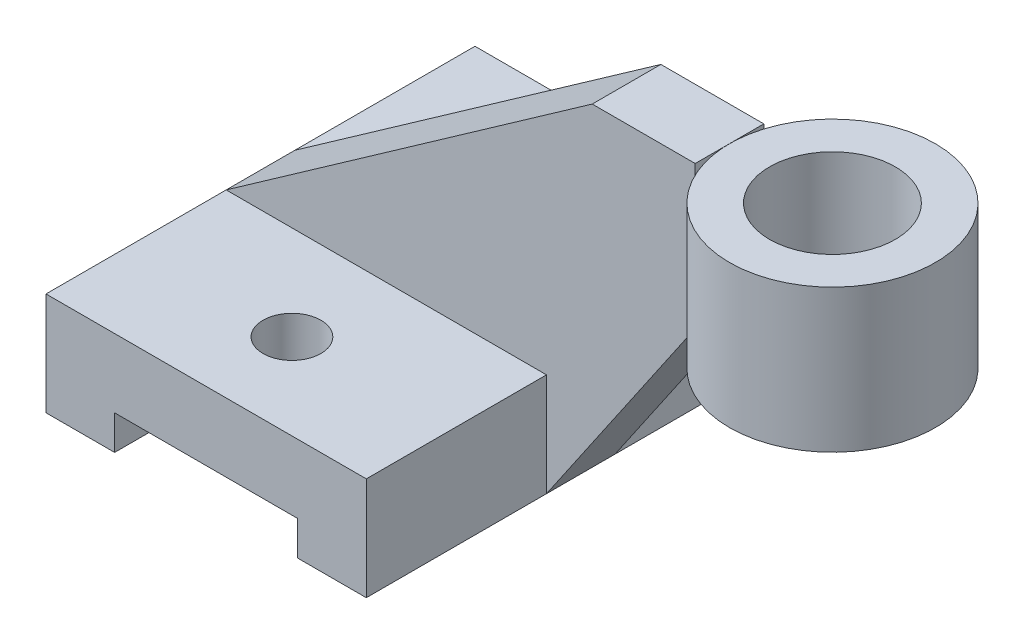
ISO-10303-21;
HEADER;
FILE_DESCRIPTION(('STEP AP214'),'2;1');
FILE_NAME('part.step','',(''),(''),'','','');
FILE_SCHEMA(('AUTOMOTIVE_DESIGN { 1 0 10303 214 1 1 1 1 }'));
ENDSEC;
DATA;
#1=APPLICATION_CONTEXT('core data for automotive mechanical design processes');
#2=APPLICATION_PROTOCOL_DEFINITION('international standard','automotive_design',2000,#1);
#3=PRODUCT_CONTEXT('',#1,'mechanical');
#4=PRODUCT('Part','Part','',(#3));
#5=PRODUCT_RELATED_PRODUCT_CATEGORY('part','',(#4));
#6=PRODUCT_DEFINITION_FORMATION('','',#4);
#7=PRODUCT_DEFINITION_CONTEXT('part definition',#1,'design');
#8=PRODUCT_DEFINITION('design','',#6,#7);
#9=PRODUCT_DEFINITION_SHAPE('','',#8);
#10=(LENGTH_UNIT() NAMED_UNIT(*) SI_UNIT(.MILLI.,.METRE.));
#11=(NAMED_UNIT(*) PLANE_ANGLE_UNIT() SI_UNIT($,.RADIAN.));
#12=(NAMED_UNIT(*) SI_UNIT($,.STERADIAN.) SOLID_ANGLE_UNIT());
#13=UNCERTAINTY_MEASURE_WITH_UNIT(LENGTH_MEASURE(1.E-05),#10,'distance_accuracy_value','');
#14=(GEOMETRIC_REPRESENTATION_CONTEXT(3) GLOBAL_UNCERTAINTY_ASSIGNED_CONTEXT((#13)) GLOBAL_UNIT_ASSIGNED_CONTEXT((#10,
#11,#12)) REPRESENTATION_CONTEXT('',''));
#15=CARTESIAN_POINT('',(0.,0.,0.));
#16=DIRECTION('',(0.,0.,1.));
#17=DIRECTION('',(1.,0.,0.));
#18=AXIS2_PLACEMENT_3D('',#15,#16,#17);
#19=CARTESIAN_POINT('',(72.,38.,0.));
#20=DIRECTION('',(0.,1.,0.));
#21=DIRECTION('',(0.,0.,1.));
#22=AXIS2_PLACEMENT_3D('',#19,#20,#21);
#23=CYLINDRICAL_SURFACE('',#22,18.);
#24=CARTESIAN_POINT('',(72.,38.,0.));
#25=DIRECTION('',(0.,1.,0.));
#26=DIRECTION('',(0.,0.,1.));
#27=AXIS2_PLACEMENT_3D('',#24,#25,#26);
#28=CIRCLE('',#27,18.);
#29=CARTESIAN_POINT('',(72.,38.,18.));
#30=VERTEX_POINT('',#29);
#31=EDGE_CURVE('E11',#30,#30,#28,.T.);
#32=ORIENTED_EDGE('',*,*,#31,.T.);
#33=EDGE_LOOP('',(#32));
#34=FACE_BOUND('',#33,.T.);
#35=CARTESIAN_POINT('',(72.,63.,0.));
#36=DIRECTION('',(0.,1.,0.));
#37=DIRECTION('',(0.,0.,1.));
#38=AXIS2_PLACEMENT_3D('',#35,#36,#37);
#39=CIRCLE('',#38,18.);
#40=CARTESIAN_POINT('',(72.,63.,18.));
#41=VERTEX_POINT('',#40);
#42=EDGE_CURVE('E50',#41,#41,#39,.T.);
#43=ORIENTED_EDGE('',*,*,#42,.F.);
#44=EDGE_LOOP('',(#43));
#45=FACE_BOUND('',#44,.T.);
#46=ADVANCED_FACE('F47',(#34,#45),#23,.T.);
#47=CARTESIAN_POINT('',(72.,38.,0.));
#48=DIRECTION('',(0.,1.,0.));
#49=DIRECTION('',(0.,0.,1.));
#50=AXIS2_PLACEMENT_3D('',#47,#48,#49);
#51=PLANE('',#50);
#52=CARTESIAN_POINT('',(72.,38.,0.));
#53=DIRECTION('',(0.,1.,0.));
#54=DIRECTION('',(0.,0.,1.));
#55=AXIS2_PLACEMENT_3D('',#52,#53,#54);
#56=CIRCLE('',#55,11.);
#57=CARTESIAN_POINT('',(72.,38.,11.));
#58=VERTEX_POINT('',#57);
#59=EDGE_CURVE('E57',#58,#58,#56,.T.);
#60=ORIENTED_EDGE('',*,*,#59,.T.);
#61=EDGE_LOOP('',(#60));
#62=FACE_BOUND('',#61,.T.);
#63=ORIENTED_EDGE('',*,*,#31,.F.);
#64=EDGE_LOOP('',(#63));
#65=FACE_BOUND('',#64,.T.);
#66=ADVANCED_FACE('F65',(#62,#65),#51,.F.);
#67=CARTESIAN_POINT('',(72.,63.,0.));
#68=DIRECTION('',(0.,1.,0.));
#69=DIRECTION('',(0.,0.,1.));
#70=AXIS2_PLACEMENT_3D('',#67,#68,#69);
#71=PLANE('',#70);
#72=CARTESIAN_POINT('',(72.,63.,0.));
#73=DIRECTION('',(0.,1.,0.));
#74=DIRECTION('',(0.,0.,1.));
#75=AXIS2_PLACEMENT_3D('',#72,#73,#74);
#76=CIRCLE('',#75,11.);
#77=CARTESIAN_POINT('',(72.,63.,11.));
#78=VERTEX_POINT('',#77);
#79=EDGE_CURVE('E59',#78,#78,#76,.T.);
#80=ORIENTED_EDGE('',*,*,#79,.F.);
#81=EDGE_LOOP('',(#80));
#82=FACE_BOUND('',#81,.T.);
#83=ORIENTED_EDGE('',*,*,#42,.T.);
#84=EDGE_LOOP('',(#83));
#85=FACE_BOUND('',#84,.T.);
#86=ADVANCED_FACE('F71',(#82,#85),#71,.T.);
#87=CARTESIAN_POINT('',(72.,38.,0.));
#88=DIRECTION('',(0.,1.,0.));
#89=DIRECTION('',(0.,0.,1.));
#90=AXIS2_PLACEMENT_3D('',#87,#88,#89);
#91=CYLINDRICAL_SURFACE('',#90,11.);
#92=ORIENTED_EDGE('',*,*,#59,.F.);
#93=EDGE_LOOP('',(#92));
#94=FACE_BOUND('',#93,.T.);
#95=ORIENTED_EDGE('',*,*,#79,.T.);
#96=EDGE_LOOP('',(#95));
#97=FACE_BOUND('',#96,.T.);
#98=ADVANCED_FACE('F68',(#94,#97),#91,.F.);
#99=CLOSED_SHELL('',(#46,#66,#86,#98));
#100=MANIFOLD_SOLID_BREP('B2',#99);
#101=CARTESIAN_POINT('',(28.,18.,37.5));
#102=DIRECTION('',(-1.,0.,0.));
#103=DIRECTION('',(0.,0.,1.));
#104=AXIS2_PLACEMENT_3D('',#101,#102,#103);
#105=PLANE('',#104);
#106=DIRECTION('',(0.,-1.,0.));
#107=VECTOR('',#106,1.);
#108=CARTESIAN_POINT('',(28.,18.,6.));
#109=LINE('',#108,#107);
#110=CARTESIAN_POINT('',(28.,18.,6.));
#111=VERTEX_POINT('',#110);
#112=CARTESIAN_POINT('',(28.,0.,6.));
#113=VERTEX_POINT('',#112);
#114=EDGE_CURVE('E342',#111,#113,#109,.T.);
#115=ORIENTED_EDGE('',*,*,#114,.F.);
#116=DIRECTION('',(0.,0.,-1.));
#117=VECTOR('',#116,1.);
#118=CARTESIAN_POINT('',(28.,18.,37.5));
#119=LINE('',#118,#117);
#120=CARTESIAN_POINT('',(28.,18.,37.5));
#121=VERTEX_POINT('',#120);
#122=EDGE_CURVE('E243',#121,#111,#119,.T.);
#123=ORIENTED_EDGE('',*,*,#122,.F.);
#124=DIRECTION('',(0.,-1.,0.));
#125=VECTOR('',#124,1.);
#126=CARTESIAN_POINT('',(28.,18.,37.5));
#127=LINE('',#126,#125);
#128=CARTESIAN_POINT('',(28.,0.,37.5));
#129=VERTEX_POINT('',#128);
#130=EDGE_CURVE('E257',#121,#129,#127,.T.);
#131=ORIENTED_EDGE('',*,*,#130,.T.);
#132=DIRECTION('',(0.,0.,-1.));
#133=VECTOR('',#132,1.);
#134=CARTESIAN_POINT('',(28.,0.,37.5));
#135=LINE('',#134,#133);
#136=EDGE_CURVE('E258',#129,#113,#135,.T.);
#137=ORIENTED_EDGE('',*,*,#136,.T.);
#138=EDGE_LOOP('',(#115,#123,#131,#137));
#139=FACE_BOUND('',#138,.T.);
#140=ADVANCED_FACE('F109',(#139),#105,.F.);
#141=CARTESIAN_POINT('',(0.,18.,0.));
#142=DIRECTION('',(0.,-1.,0.));
#143=DIRECTION('',(0.,0.,-1.));
#144=AXIS2_PLACEMENT_3D('',#141,#142,#143);
#145=PLANE('',#144);
#146=CARTESIAN_POINT('',(0.,18.,22.5));
#147=DIRECTION('',(0.,1.,0.));
#148=DIRECTION('',(0.,0.,1.));
#149=AXIS2_PLACEMENT_3D('',#146,#147,#148);
#150=CIRCLE('',#149,5.05584137297693);
#151=CARTESIAN_POINT('',(0.,18.,27.5558413729769));
#152=VERTEX_POINT('',#151);
#153=EDGE_CURVE('E275',#152,#152,#150,.T.);
#154=ORIENTED_EDGE('',*,*,#153,.F.);
#155=EDGE_LOOP('',(#154));
#156=FACE_BOUND('',#155,.T.);
#157=DIRECTION('',(1.,0.,0.));
#158=VECTOR('',#157,1.);
#159=CARTESIAN_POINT('',(-28.,18.,6.));
#160=LINE('',#159,#158);
#161=CARTESIAN_POINT('',(-28.,18.,6.));
#162=VERTEX_POINT('',#161);
#163=EDGE_CURVE('E346',#162,#111,#160,.T.);
#164=ORIENTED_EDGE('',*,*,#163,.F.);
#165=DIRECTION('',(0.,0.,1.));
#166=VECTOR('',#165,1.);
#167=CARTESIAN_POINT('',(-28.,18.,37.5));
#168=LINE('',#167,#166);
#169=CARTESIAN_POINT('',(-28.,18.,37.5));
#170=VERTEX_POINT('',#169);
#171=EDGE_CURVE('E254',#162,#170,#168,.T.);
#172=ORIENTED_EDGE('',*,*,#171,.T.);
#173=DIRECTION('',(1.,0.,0.));
#174=VECTOR('',#173,1.);
#175=CARTESIAN_POINT('',(-28.,18.,37.5));
#176=LINE('',#175,#174);
#177=EDGE_CURVE('E135',#170,#121,#176,.T.);
#178=ORIENTED_EDGE('',*,*,#177,.T.);
#179=ORIENTED_EDGE('',*,*,#122,.T.);
#180=EDGE_LOOP('',(#164,#172,#178,#179));
#181=FACE_BOUND('',#180,.T.);
#182=ADVANCED_FACE('F345',(#156,#181),#145,.F.);
#183=CARTESIAN_POINT('',(0.,0.,0.));
#184=DIRECTION('',(0.,-1.,0.));
#185=DIRECTION('',(0.,0.,-1.));
#186=AXIS2_PLACEMENT_3D('',#183,#184,#185);
#187=PLANE('',#186);
#188=DIRECTION('',(0.,0.,1.));
#189=VECTOR('',#188,1.);
#190=CARTESIAN_POINT('',(-16.,0.,-37.5));
#191=LINE('',#190,#189);
#192=CARTESIAN_POINT('',(-16.,0.,-37.5));
#193=VERTEX_POINT('',#192);
#194=CARTESIAN_POINT('',(-16.,0.,37.5));
#195=VERTEX_POINT('',#194);
#196=EDGE_CURVE('E251',#193,#195,#191,.T.);
#197=ORIENTED_EDGE('',*,*,#196,.T.);
#198=DIRECTION('',(1.,0.,0.));
#199=VECTOR('',#198,1.);
#200=CARTESIAN_POINT('',(-28.,0.,37.5));
#201=LINE('',#200,#199);
#202=CARTESIAN_POINT('',(-28.,0.,37.5));
#203=VERTEX_POINT('',#202);
#204=EDGE_CURVE('E244',#203,#195,#201,.T.);
#205=ORIENTED_EDGE('',*,*,#204,.F.);
#206=DIRECTION('',(0.,0.,1.));
#207=VECTOR('',#206,1.);
#208=CARTESIAN_POINT('',(-28.,0.,37.5));
#209=LINE('',#208,#207);
#210=CARTESIAN_POINT('',(-28.,0.,-37.5));
#211=VERTEX_POINT('',#210);
#212=EDGE_CURVE('E266',#211,#203,#209,.T.);
#213=ORIENTED_EDGE('',*,*,#212,.F.);
#214=DIRECTION('',(-1.,0.,0.));
#215=VECTOR('',#214,1.);
#216=CARTESIAN_POINT('',(-28.,0.,-37.5));
#217=LINE('',#216,#215);
#218=EDGE_CURVE('E261',#193,#211,#217,.T.);
#219=ORIENTED_EDGE('',*,*,#218,.F.);
#220=EDGE_LOOP('',(#197,#205,#213,#219));
#221=FACE_BOUND('',#220,.T.);
#222=ADVANCED_FACE('F314',(#221),#187,.T.);
#223=CARTESIAN_POINT('',(28.,18.,-6.));
#224=VERTEX_POINT('',#223);
#225=CARTESIAN_POINT('',(28.,18.,-37.5));
#226=VERTEX_POINT('',#225);
#227=EDGE_CURVE('E164',#224,#226,#119,.T.);
#228=ORIENTED_EDGE('',*,*,#227,.F.);
#229=DIRECTION('',(0.,-1.,0.));
#230=VECTOR('',#229,1.);
#231=CARTESIAN_POINT('',(28.,18.,-6.));
#232=LINE('',#231,#230);
#233=CARTESIAN_POINT('',(28.,0.,-6.));
#234=VERTEX_POINT('',#233);
#235=EDGE_CURVE('E223',#224,#234,#232,.T.);
#236=ORIENTED_EDGE('',*,*,#235,.T.);
#237=CARTESIAN_POINT('',(28.,0.,-37.5));
#238=VERTEX_POINT('',#237);
#239=EDGE_CURVE('E262',#234,#238,#135,.T.);
#240=ORIENTED_EDGE('',*,*,#239,.T.);
#241=DIRECTION('',(0.,-1.,0.));
#242=VECTOR('',#241,1.);
#243=CARTESIAN_POINT('',(28.,18.,-37.5));
#244=LINE('',#243,#242);
#245=EDGE_CURVE('E45',#226,#238,#244,.T.);
#246=ORIENTED_EDGE('',*,*,#245,.F.);
#247=EDGE_LOOP('',(#228,#236,#240,#246));
#248=FACE_BOUND('',#247,.T.);
#249=ADVANCED_FACE('F111',(#248),#105,.F.);
#250=CARTESIAN_POINT('',(-28.,18.,-37.5));
#251=DIRECTION('',(0.,0.,1.));
#252=DIRECTION('',(1.,0.,0.));
#253=AXIS2_PLACEMENT_3D('',#250,#251,#252);
#254=PLANE('',#253);
#255=DIRECTION('',(-1.,0.,0.));
#256=VECTOR('',#255,1.);
#257=CARTESIAN_POINT('',(-16.,6.,-37.5));
#258=LINE('',#257,#256);
#259=CARTESIAN_POINT('',(16.,6.,-37.5));
#260=VERTEX_POINT('',#259);
#261=CARTESIAN_POINT('',(-16.,6.,-37.5));
#262=VERTEX_POINT('',#261);
#263=EDGE_CURVE('E297',#260,#262,#258,.T.);
#264=ORIENTED_EDGE('',*,*,#263,.T.);
#265=DIRECTION('',(0.,-1.,0.));
#266=VECTOR('',#265,1.);
#267=CARTESIAN_POINT('',(-16.,0.,-37.5));
#268=LINE('',#267,#266);
#269=EDGE_CURVE('E292',#262,#193,#268,.T.);
#270=ORIENTED_EDGE('',*,*,#269,.T.);
#271=ORIENTED_EDGE('',*,*,#218,.T.);
#272=DIRECTION('',(0.,-1.,0.));
#273=VECTOR('',#272,1.);
#274=CARTESIAN_POINT('',(-28.,18.,-37.5));
#275=LINE('',#274,#273);
#276=CARTESIAN_POINT('',(-28.,18.,-37.5));
#277=VERTEX_POINT('',#276);
#278=EDGE_CURVE('E118',#277,#211,#275,.T.);
#279=ORIENTED_EDGE('',*,*,#278,.F.);
#280=DIRECTION('',(-1.,0.,0.));
#281=VECTOR('',#280,1.);
#282=CARTESIAN_POINT('',(-28.,18.,-37.5));
#283=LINE('',#282,#281);
#284=EDGE_CURVE('E246',#226,#277,#283,.T.);
#285=ORIENTED_EDGE('',*,*,#284,.F.);
#286=ORIENTED_EDGE('',*,*,#245,.T.);
#287=CARTESIAN_POINT('',(16.,0.,-37.5));
#288=VERTEX_POINT('',#287);
#289=EDGE_CURVE('E263',#238,#288,#217,.T.);
#290=ORIENTED_EDGE('',*,*,#289,.T.);
#291=DIRECTION('',(0.,1.,0.));
#292=VECTOR('',#291,1.);
#293=CARTESIAN_POINT('',(16.,0.,-37.5));
#294=LINE('',#293,#292);
#295=EDGE_CURVE('E126',#288,#260,#294,.T.);
#296=ORIENTED_EDGE('',*,*,#295,.T.);
#297=EDGE_LOOP('',(#264,#270,#271,#279,#285,#286,#290,#296));
#298=FACE_BOUND('',#297,.T.);
#299=ADVANCED_FACE('F328',(#298),#254,.F.);
#300=CARTESIAN_POINT('',(-28.,18.,37.5));
#301=DIRECTION('',(1.,0.,0.));
#302=DIRECTION('',(0.,0.,-1.));
#303=AXIS2_PLACEMENT_3D('',#300,#301,#302);
#304=PLANE('',#303);
#305=ORIENTED_EDGE('',*,*,#212,.T.);
#306=DIRECTION('',(0.,-1.,0.));
#307=VECTOR('',#306,1.);
#308=CARTESIAN_POINT('',(-28.,18.,37.5));
#309=LINE('',#308,#307);
#310=EDGE_CURVE('E269',#170,#203,#309,.T.);
#311=ORIENTED_EDGE('',*,*,#310,.F.);
#312=ORIENTED_EDGE('',*,*,#171,.F.);
#313=DIRECTION('',(0.,0.,1.));
#314=VECTOR('',#313,1.);
#315=CARTESIAN_POINT('',(-28.,18.,-6.));
#316=LINE('',#315,#314);
#317=CARTESIAN_POINT('',(-28.,18.,-6.));
#318=VERTEX_POINT('',#317);
#319=EDGE_CURVE('E286',#318,#162,#316,.T.);
#320=ORIENTED_EDGE('',*,*,#319,.F.);
#321=EDGE_CURVE('E238',#277,#318,#168,.T.);
#322=ORIENTED_EDGE('',*,*,#321,.F.);
#323=ORIENTED_EDGE('',*,*,#278,.T.);
#324=EDGE_LOOP('',(#305,#311,#312,#320,#322,#323));
#325=FACE_BOUND('',#324,.T.);
#326=ADVANCED_FACE('F324',(#325),#304,.F.);
#327=CARTESIAN_POINT('',(-28.,18.,37.5));
#328=DIRECTION('',(0.,0.,-1.));
#329=DIRECTION('',(-1.,0.,0.));
#330=AXIS2_PLACEMENT_3D('',#327,#328,#329);
#331=PLANE('',#330);
#332=ORIENTED_EDGE('',*,*,#204,.T.);
#333=DIRECTION('',(0.,-1.,0.));
#334=VECTOR('',#333,1.);
#335=CARTESIAN_POINT('',(-16.,0.,37.5));
#336=LINE('',#335,#334);
#337=CARTESIAN_POINT('',(-16.,6.,37.5));
#338=VERTEX_POINT('',#337);
#339=EDGE_CURVE('E279',#338,#195,#336,.T.);
#340=ORIENTED_EDGE('',*,*,#339,.F.);
#341=DIRECTION('',(-1.,0.,0.));
#342=VECTOR('',#341,1.);
#343=CARTESIAN_POINT('',(-16.,6.,37.5));
#344=LINE('',#343,#342);
#345=CARTESIAN_POINT('',(16.,6.,37.5));
#346=VERTEX_POINT('',#345);
#347=EDGE_CURVE('E295',#346,#338,#344,.T.);
#348=ORIENTED_EDGE('',*,*,#347,.F.);
#349=DIRECTION('',(0.,1.,0.));
#350=VECTOR('',#349,1.);
#351=CARTESIAN_POINT('',(16.,0.,37.5));
#352=LINE('',#351,#350);
#353=CARTESIAN_POINT('',(16.,0.,37.5));
#354=VERTEX_POINT('',#353);
#355=EDGE_CURVE('E301',#354,#346,#352,.T.);
#356=ORIENTED_EDGE('',*,*,#355,.F.);
#357=EDGE_CURVE('E156',#354,#129,#201,.T.);
#358=ORIENTED_EDGE('',*,*,#357,.T.);
#359=ORIENTED_EDGE('',*,*,#130,.F.);
#360=ORIENTED_EDGE('',*,*,#177,.F.);
#361=ORIENTED_EDGE('',*,*,#310,.T.);
#362=EDGE_LOOP('',(#332,#340,#348,#356,#358,#359,#360,#361));
#363=FACE_BOUND('',#362,.T.);
#364=ADVANCED_FACE('F319',(#363),#331,.F.);
#365=CARTESIAN_POINT('',(0.,18.,-22.5));
#366=DIRECTION('',(0.,1.,0.));
#367=DIRECTION('',(0.,0.,1.));
#368=AXIS2_PLACEMENT_3D('',#365,#366,#367);
#369=CIRCLE('',#368,5.63097130675669);
#370=CARTESIAN_POINT('',(0.,18.,-16.8690286932433));
#371=VERTEX_POINT('',#370);
#372=EDGE_CURVE('E281',#371,#371,#369,.T.);
#373=ORIENTED_EDGE('',*,*,#372,.F.);
#374=EDGE_LOOP('',(#373));
#375=FACE_BOUND('',#374,.T.);
#376=ORIENTED_EDGE('',*,*,#321,.T.);
#377=DIRECTION('',(1.,0.,0.));
#378=VECTOR('',#377,1.);
#379=CARTESIAN_POINT('',(-28.,18.,-6.));
#380=LINE('',#379,#378);
#381=EDGE_CURVE('E226',#318,#224,#380,.T.);
#382=ORIENTED_EDGE('',*,*,#381,.T.);
#383=ORIENTED_EDGE('',*,*,#227,.T.);
#384=ORIENTED_EDGE('',*,*,#284,.T.);
#385=EDGE_LOOP('',(#376,#382,#383,#384));
#386=FACE_BOUND('',#385,.T.);
#387=ADVANCED_FACE('F236',(#375,#386),#145,.F.);
#388=DIRECTION('',(0.,0.,1.));
#389=VECTOR('',#388,1.);
#390=CARTESIAN_POINT('',(16.,0.,-37.5));
#391=LINE('',#390,#389);
#392=EDGE_CURVE('E309',#288,#354,#391,.T.);
#393=ORIENTED_EDGE('',*,*,#392,.F.);
#394=ORIENTED_EDGE('',*,*,#289,.F.);
#395=ORIENTED_EDGE('',*,*,#239,.F.);
#396=DIRECTION('',(0.,0.,1.));
#397=VECTOR('',#396,1.);
#398=CARTESIAN_POINT('',(28.,0.,-6.));
#399=LINE('',#398,#397);
#400=EDGE_CURVE('E338',#234,#113,#399,.T.);
#401=ORIENTED_EDGE('',*,*,#400,.T.);
#402=ORIENTED_EDGE('',*,*,#136,.F.);
#403=ORIENTED_EDGE('',*,*,#357,.F.);
#404=EDGE_LOOP('',(#393,#394,#395,#401,#402,#403));
#405=FACE_BOUND('',#404,.T.);
#406=ADVANCED_FACE('F335',(#405),#187,.T.);
#407=CARTESIAN_POINT('',(-16.,0.,-37.5));
#408=DIRECTION('',(-1.,0.,0.));
#409=DIRECTION('',(0.,0.,1.));
#410=AXIS2_PLACEMENT_3D('',#407,#408,#409);
#411=PLANE('',#410);
#412=ORIENTED_EDGE('',*,*,#339,.T.);
#413=ORIENTED_EDGE('',*,*,#196,.F.);
#414=ORIENTED_EDGE('',*,*,#269,.F.);
#415=DIRECTION('',(0.,0.,1.));
#416=VECTOR('',#415,1.);
#417=CARTESIAN_POINT('',(-16.,6.,-37.5));
#418=LINE('',#417,#416);
#419=EDGE_CURVE('E306',#262,#338,#418,.T.);
#420=ORIENTED_EDGE('',*,*,#419,.T.);
#421=EDGE_LOOP('',(#412,#413,#414,#420));
#422=FACE_BOUND('',#421,.T.);
#423=ADVANCED_FACE('F330',(#422),#411,.F.);
#424=CARTESIAN_POINT('',(-16.,6.,-37.5));
#425=DIRECTION('',(0.,1.,0.));
#426=DIRECTION('',(0.,0.,1.));
#427=AXIS2_PLACEMENT_3D('',#424,#425,#426);
#428=PLANE('',#427);
#429=CARTESIAN_POINT('',(0.,6.,22.5));
#430=DIRECTION('',(0.,1.,0.));
#431=DIRECTION('',(0.,0.,1.));
#432=AXIS2_PLACEMENT_3D('',#429,#430,#431);
#433=CIRCLE('',#432,5.05584137297693);
#434=CARTESIAN_POINT('',(0.,6.,27.5558413729769));
#435=VERTEX_POINT('',#434);
#436=EDGE_CURVE('E113',#435,#435,#433,.T.);
#437=ORIENTED_EDGE('',*,*,#436,.T.);
#438=EDGE_LOOP('',(#437));
#439=FACE_BOUND('',#438,.T.);
#440=CARTESIAN_POINT('',(0.,6.,-22.5));
#441=DIRECTION('',(0.,1.,0.));
#442=DIRECTION('',(0.,0.,1.));
#443=AXIS2_PLACEMENT_3D('',#440,#441,#442);
#444=CIRCLE('',#443,5.63097130675669);
#445=CARTESIAN_POINT('',(0.,6.,-16.8690286932433));
#446=VERTEX_POINT('',#445);
#447=EDGE_CURVE('E273',#446,#446,#444,.T.);
#448=ORIENTED_EDGE('',*,*,#447,.T.);
#449=EDGE_LOOP('',(#448));
#450=FACE_BOUND('',#449,.T.);
#451=ORIENTED_EDGE('',*,*,#347,.T.);
#452=ORIENTED_EDGE('',*,*,#419,.F.);
#453=ORIENTED_EDGE('',*,*,#263,.F.);
#454=DIRECTION('',(0.,0.,1.));
#455=VECTOR('',#454,1.);
#456=CARTESIAN_POINT('',(16.,6.,-37.5));
#457=LINE('',#456,#455);
#458=EDGE_CURVE('E308',#260,#346,#457,.T.);
#459=ORIENTED_EDGE('',*,*,#458,.T.);
#460=EDGE_LOOP('',(#451,#452,#453,#459));
#461=FACE_BOUND('',#460,.T.);
#462=ADVANCED_FACE('F332',(#439,#450,#461),#428,.F.);
#463=CARTESIAN_POINT('',(16.,0.,-37.5));
#464=DIRECTION('',(1.,0.,0.));
#465=DIRECTION('',(0.,0.,-1.));
#466=AXIS2_PLACEMENT_3D('',#463,#464,#465);
#467=PLANE('',#466);
#468=ORIENTED_EDGE('',*,*,#355,.T.);
#469=ORIENTED_EDGE('',*,*,#458,.F.);
#470=ORIENTED_EDGE('',*,*,#295,.F.);
#471=ORIENTED_EDGE('',*,*,#392,.T.);
#472=EDGE_LOOP('',(#468,#469,#470,#471));
#473=FACE_BOUND('',#472,.T.);
#474=ADVANCED_FACE('F424',(#473),#467,.F.);
#475=CARTESIAN_POINT('',(0.,0.,-22.5));
#476=DIRECTION('',(0.,1.,0.));
#477=DIRECTION('',(0.,0.,1.));
#478=AXIS2_PLACEMENT_3D('',#475,#476,#477);
#479=CYLINDRICAL_SURFACE('',#478,5.63097130675669);
#480=ORIENTED_EDGE('',*,*,#372,.T.);
#481=EDGE_LOOP('',(#480));
#482=FACE_BOUND('',#481,.T.);
#483=ORIENTED_EDGE('',*,*,#447,.F.);
#484=EDGE_LOOP('',(#483));
#485=FACE_BOUND('',#484,.T.);
#486=ADVANCED_FACE('F427',(#482,#485),#479,.F.);
#487=CARTESIAN_POINT('',(0.,0.,22.5));
#488=DIRECTION('',(0.,1.,0.));
#489=DIRECTION('',(0.,0.,1.));
#490=AXIS2_PLACEMENT_3D('',#487,#488,#489);
#491=CYLINDRICAL_SURFACE('',#490,5.05584137297693);
#492=ORIENTED_EDGE('',*,*,#153,.T.);
#493=EDGE_LOOP('',(#492));
#494=FACE_BOUND('',#493,.T.);
#495=ORIENTED_EDGE('',*,*,#436,.F.);
#496=EDGE_LOOP('',(#495));
#497=FACE_BOUND('',#496,.T.);
#498=ADVANCED_FACE('F433',(#494,#497),#491,.F.);
#499=CARTESIAN_POINT('',(-28.,18.,-6.));
#500=DIRECTION('',(-0.575176751990256,0.818029158386142,0.));
#501=DIRECTION('',(-0.818029158386142,-0.575176751990256,0.));
#502=AXIS2_PLACEMENT_3D('',#499,#500,#501);
#503=PLANE('',#502);
#504=DIRECTION('',(-0.818029158386142,-0.575176751990256,0.));
#505=VECTOR('',#504,1.);
#506=CARTESIAN_POINT('',(-28.,18.,6.));
#507=LINE('',#506,#505);
#508=CARTESIAN_POINT('',(36.,63.,6.));
#509=VERTEX_POINT('',#508);
#510=EDGE_CURVE('E240',#509,#162,#507,.T.);
#511=ORIENTED_EDGE('',*,*,#510,.F.);
#512=DIRECTION('',(0.,0.,1.));
#513=VECTOR('',#512,1.);
#514=CARTESIAN_POINT('',(36.,63.,-6.));
#515=LINE('',#514,#513);
#516=CARTESIAN_POINT('',(36.,63.,-6.));
#517=VERTEX_POINT('',#516);
#518=EDGE_CURVE('E289',#517,#509,#515,.T.);
#519=ORIENTED_EDGE('',*,*,#518,.F.);
#520=DIRECTION('',(-0.818029158386142,-0.575176751990256,0.));
#521=VECTOR('',#520,1.);
#522=CARTESIAN_POINT('',(-28.,18.,-6.));
#523=LINE('',#522,#521);
#524=EDGE_CURVE('E239',#517,#318,#523,.T.);
#525=ORIENTED_EDGE('',*,*,#524,.T.);
#526=ORIENTED_EDGE('',*,*,#319,.T.);
#527=EDGE_LOOP('',(#511,#519,#525,#526));
#528=FACE_BOUND('',#527,.T.);
#529=ADVANCED_FACE('F361',(#528),#503,.T.);
#530=CARTESIAN_POINT('',(0.,0.,-6.));
#531=DIRECTION('',(0.,0.,1.));
#532=DIRECTION('',(1.,0.,0.));
#533=AXIS2_PLACEMENT_3D('',#530,#531,#532);
#534=PLANE('',#533);
#535=ORIENTED_EDGE('',*,*,#524,.F.);
#536=DIRECTION('',(-1.,0.,0.));
#537=VECTOR('',#536,1.);
#538=CARTESIAN_POINT('',(36.,63.,-6.));
#539=LINE('',#538,#537);
#540=CARTESIAN_POINT('',(54.,63.,-6.));
#541=VERTEX_POINT('',#540);
#542=EDGE_CURVE('E363',#541,#517,#539,.T.);
#543=ORIENTED_EDGE('',*,*,#542,.F.);
#544=DIRECTION('',(0.,1.,0.));
#545=VECTOR('',#544,1.);
#546=CARTESIAN_POINT('',(54.,63.,-6.));
#547=LINE('',#546,#545);
#548=CARTESIAN_POINT('',(54.,38.,-6.));
#549=VERTEX_POINT('',#548);
#550=EDGE_CURVE('E365',#549,#541,#547,.T.);
#551=ORIENTED_EDGE('',*,*,#550,.F.);
#552=DIRECTION('',(0.56468391559199,0.825307261249832,0.));
#553=VECTOR('',#552,1.);
#554=CARTESIAN_POINT('',(54.,38.,-6.));
#555=LINE('',#554,#553);
#556=EDGE_CURVE('E230',#234,#549,#555,.T.);
#557=ORIENTED_EDGE('',*,*,#556,.F.);
#558=ORIENTED_EDGE('',*,*,#235,.F.);
#559=ORIENTED_EDGE('',*,*,#381,.F.);
#560=EDGE_LOOP('',(#535,#543,#551,#557,#558,#559));
#561=FACE_BOUND('',#560,.T.);
#562=ADVANCED_FACE('F225',(#561),#534,.F.);
#563=CARTESIAN_POINT('',(0.,0.,6.));
#564=DIRECTION('',(0.,0.,1.));
#565=DIRECTION('',(1.,0.,0.));
#566=AXIS2_PLACEMENT_3D('',#563,#564,#565);
#567=PLANE('',#566);
#568=DIRECTION('',(-1.,0.,0.));
#569=VECTOR('',#568,1.);
#570=CARTESIAN_POINT('',(36.,63.,6.));
#571=LINE('',#570,#569);
#572=CARTESIAN_POINT('',(54.,63.,6.));
#573=VERTEX_POINT('',#572);
#574=EDGE_CURVE('E233',#573,#509,#571,.T.);
#575=ORIENTED_EDGE('',*,*,#574,.T.);
#576=ORIENTED_EDGE('',*,*,#510,.T.);
#577=ORIENTED_EDGE('',*,*,#163,.T.);
#578=ORIENTED_EDGE('',*,*,#114,.T.);
#579=DIRECTION('',(0.56468391559199,0.825307261249832,0.));
#580=VECTOR('',#579,1.);
#581=CARTESIAN_POINT('',(54.,38.,6.));
#582=LINE('',#581,#580);
#583=CARTESIAN_POINT('',(54.,38.,6.));
#584=VERTEX_POINT('',#583);
#585=EDGE_CURVE('E372',#113,#584,#582,.T.);
#586=ORIENTED_EDGE('',*,*,#585,.T.);
#587=DIRECTION('',(0.,1.,0.));
#588=VECTOR('',#587,1.);
#589=CARTESIAN_POINT('',(54.,63.,6.));
#590=LINE('',#589,#588);
#591=EDGE_CURVE('E375',#584,#573,#590,.T.);
#592=ORIENTED_EDGE('',*,*,#591,.T.);
#593=EDGE_LOOP('',(#575,#576,#577,#578,#586,#592));
#594=FACE_BOUND('',#593,.T.);
#595=ADVANCED_FACE('F384',(#594),#567,.T.);
#596=CARTESIAN_POINT('',(36.,63.,-6.));
#597=DIRECTION('',(0.,1.,0.));
#598=DIRECTION('',(0.,0.,1.));
#599=AXIS2_PLACEMENT_3D('',#596,#597,#598);
#600=PLANE('',#599);
#601=ORIENTED_EDGE('',*,*,#574,.F.);
#602=DIRECTION('',(0.,0.,1.));
#603=VECTOR('',#602,1.);
#604=CARTESIAN_POINT('',(54.,63.,-6.));
#605=LINE('',#604,#603);
#606=EDGE_CURVE('E349',#541,#573,#605,.T.);
#607=ORIENTED_EDGE('',*,*,#606,.F.);
#608=ORIENTED_EDGE('',*,*,#542,.T.);
#609=ORIENTED_EDGE('',*,*,#518,.T.);
#610=EDGE_LOOP('',(#601,#607,#608,#609));
#611=FACE_BOUND('',#610,.T.);
#612=ADVANCED_FACE('F386',(#611),#600,.T.);
#613=CARTESIAN_POINT('',(54.,63.,-6.));
#614=DIRECTION('',(1.,0.,0.));
#615=DIRECTION('',(0.,0.,-1.));
#616=AXIS2_PLACEMENT_3D('',#613,#614,#615);
#617=PLANE('',#616);
#618=ORIENTED_EDGE('',*,*,#591,.F.);
#619=DIRECTION('',(0.,0.,1.));
#620=VECTOR('',#619,1.);
#621=CARTESIAN_POINT('',(54.,38.,-6.));
#622=LINE('',#621,#620);
#623=EDGE_CURVE('E352',#549,#584,#622,.T.);
#624=ORIENTED_EDGE('',*,*,#623,.F.);
#625=ORIENTED_EDGE('',*,*,#550,.T.);
#626=ORIENTED_EDGE('',*,*,#606,.T.);
#627=EDGE_LOOP('',(#618,#624,#625,#626));
#628=FACE_BOUND('',#627,.T.);
#629=ADVANCED_FACE('F383',(#628),#617,.T.);
#630=CARTESIAN_POINT('',(54.,38.,-6.));
#631=DIRECTION('',(0.825307261249832,-0.56468391559199,0.));
#632=DIRECTION('',(0.56468391559199,0.825307261249832,0.));
#633=AXIS2_PLACEMENT_3D('',#630,#631,#632);
#634=PLANE('',#633);
#635=ORIENTED_EDGE('',*,*,#585,.F.);
#636=ORIENTED_EDGE('',*,*,#400,.F.);
#637=ORIENTED_EDGE('',*,*,#556,.T.);
#638=ORIENTED_EDGE('',*,*,#623,.T.);
#639=EDGE_LOOP('',(#635,#636,#637,#638));
#640=FACE_BOUND('',#639,.T.);
#641=ADVANCED_FACE('F381',(#640),#634,.T.);
#642=CLOSED_SHELL('',(#140,#182,#222,#249,#299,#326,#364,#387,#406,#423,#462,#474,#486,#498,
#529,#562,#595,#612,#629,#641));
#643=MANIFOLD_SOLID_BREP('B6',#642);
#644=ADVANCED_BREP_SHAPE_REPRESENTATION('',(#18,#100,#643),#14);
#645=SHAPE_DEFINITION_REPRESENTATION(#9,#644);
ENDSEC;
END-ISO-10303-21;
